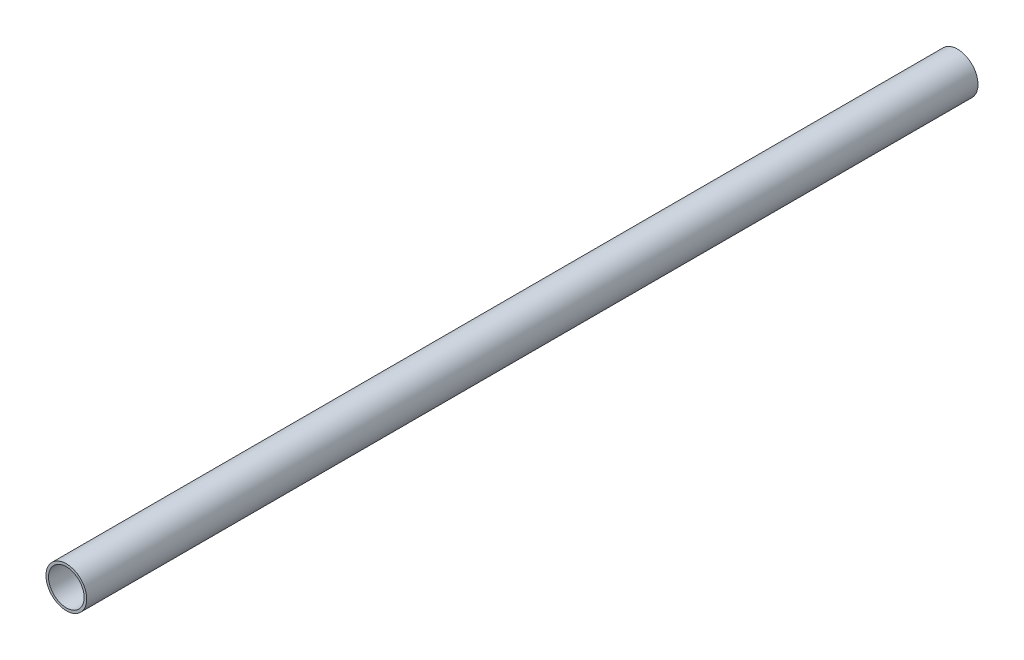
ISO-10303-21;
HEADER;
FILE_DESCRIPTION(('STEP AP214'),'2;1');
FILE_NAME('part.step','',(''),(''),'','','');
FILE_SCHEMA(('AUTOMOTIVE_DESIGN { 1 0 10303 214 1 1 1 1 }'));
ENDSEC;
DATA;
#1=APPLICATION_CONTEXT('core data for automotive mechanical design processes');
#2=APPLICATION_PROTOCOL_DEFINITION('international standard','automotive_design',2000,#1);
#3=PRODUCT_CONTEXT('',#1,'mechanical');
#4=PRODUCT('Part','Part','',(#3));
#5=PRODUCT_RELATED_PRODUCT_CATEGORY('part','',(#4));
#6=PRODUCT_DEFINITION_FORMATION('','',#4);
#7=PRODUCT_DEFINITION_CONTEXT('part definition',#1,'design');
#8=PRODUCT_DEFINITION('design','',#6,#7);
#9=PRODUCT_DEFINITION_SHAPE('','',#8);
#10=(LENGTH_UNIT() NAMED_UNIT(*) SI_UNIT(.MILLI.,.METRE.));
#11=(NAMED_UNIT(*) PLANE_ANGLE_UNIT() SI_UNIT($,.RADIAN.));
#12=(NAMED_UNIT(*) SI_UNIT($,.STERADIAN.) SOLID_ANGLE_UNIT());
#13=UNCERTAINTY_MEASURE_WITH_UNIT(LENGTH_MEASURE(1.E-05),#10,'distance_accuracy_value','');
#14=(GEOMETRIC_REPRESENTATION_CONTEXT(3) GLOBAL_UNCERTAINTY_ASSIGNED_CONTEXT((#13)) GLOBAL_UNIT_ASSIGNED_CONTEXT((#10,
#11,#12)) REPRESENTATION_CONTEXT('',''));
#15=CARTESIAN_POINT('',(0.,0.,0.));
#16=DIRECTION('',(0.,0.,1.));
#17=DIRECTION('',(1.,0.,0.));
#18=AXIS2_PLACEMENT_3D('',#15,#16,#17);
#19=CARTESIAN_POINT('',(0.,0.,700.));
#20=DIRECTION('',(0.,0.,1.));
#21=DIRECTION('',(1.,0.,0.));
#22=AXIS2_PLACEMENT_3D('',#19,#20,#21);
#23=PLANE('',#22);
#24=CARTESIAN_POINT('',(0.,0.,700.));
#25=DIRECTION('',(0.,0.,1.));
#26=DIRECTION('',(1.,0.,0.));
#27=AXIS2_PLACEMENT_3D('',#24,#25,#26);
#28=CIRCLE('',#27,16.);
#29=CARTESIAN_POINT('',(16.,0.,700.));
#30=VERTEX_POINT('',#29);
#31=EDGE_CURVE('E10',#30,#30,#28,.T.);
#32=ORIENTED_EDGE('',*,*,#31,.T.);
#33=EDGE_LOOP('',(#32));
#34=FACE_BOUND('',#33,.T.);
#35=CARTESIAN_POINT('',(0.,0.,700.));
#36=DIRECTION('',(0.,0.,1.));
#37=DIRECTION('',(1.,0.,0.));
#38=AXIS2_PLACEMENT_3D('',#35,#36,#37);
#39=CIRCLE('',#38,14.);
#40=CARTESIAN_POINT('',(14.,0.,700.));
#41=VERTEX_POINT('',#40);
#42=EDGE_CURVE('E42',#41,#41,#39,.T.);
#43=ORIENTED_EDGE('',*,*,#42,.F.);
#44=EDGE_LOOP('',(#43));
#45=FACE_BOUND('',#44,.T.);
#46=ADVANCED_FACE('F31',(#34,#45),#23,.T.);
#47=CARTESIAN_POINT('',(0.,0.,0.));
#48=DIRECTION('',(0.,0.,1.));
#49=DIRECTION('',(1.,0.,0.));
#50=AXIS2_PLACEMENT_3D('',#47,#48,#49);
#51=PLANE('',#50);
#52=CARTESIAN_POINT('',(0.,0.,0.));
#53=DIRECTION('',(0.,0.,1.));
#54=DIRECTION('',(1.,0.,0.));
#55=AXIS2_PLACEMENT_3D('',#52,#53,#54);
#56=CIRCLE('',#55,16.);
#57=CARTESIAN_POINT('',(16.,0.,0.));
#58=VERTEX_POINT('',#57);
#59=EDGE_CURVE('E35',#58,#58,#56,.T.);
#60=ORIENTED_EDGE('',*,*,#59,.F.);
#61=EDGE_LOOP('',(#60));
#62=FACE_BOUND('',#61,.T.);
#63=CARTESIAN_POINT('',(0.,0.,0.));
#64=DIRECTION('',(0.,0.,1.));
#65=DIRECTION('',(1.,0.,0.));
#66=AXIS2_PLACEMENT_3D('',#63,#64,#65);
#67=CIRCLE('',#66,14.);
#68=CARTESIAN_POINT('',(14.,0.,0.));
#69=VERTEX_POINT('',#68);
#70=EDGE_CURVE('E44',#69,#69,#67,.T.);
#71=ORIENTED_EDGE('',*,*,#70,.T.);
#72=EDGE_LOOP('',(#71));
#73=FACE_BOUND('',#72,.T.);
#74=ADVANCED_FACE('F54',(#62,#73),#51,.F.);
#75=CARTESIAN_POINT('',(0.,0.,700.));
#76=DIRECTION('',(0.,0.,-1.));
#77=DIRECTION('',(-1.,0.,0.));
#78=AXIS2_PLACEMENT_3D('',#75,#76,#77);
#79=CYLINDRICAL_SURFACE('',#78,16.);
#80=ORIENTED_EDGE('',*,*,#31,.F.);
#81=EDGE_LOOP('',(#80));
#82=FACE_BOUND('',#81,.T.);
#83=ORIENTED_EDGE('',*,*,#59,.T.);
#84=EDGE_LOOP('',(#83));
#85=FACE_BOUND('',#84,.T.);
#86=ADVANCED_FACE('F33',(#82,#85),#79,.T.);
#87=CARTESIAN_POINT('',(0.,0.,700.));
#88=DIRECTION('',(0.,0.,-1.));
#89=DIRECTION('',(-1.,0.,0.));
#90=AXIS2_PLACEMENT_3D('',#87,#88,#89);
#91=CYLINDRICAL_SURFACE('',#90,14.);
#92=ORIENTED_EDGE('',*,*,#42,.T.);
#93=EDGE_LOOP('',(#92));
#94=FACE_BOUND('',#93,.T.);
#95=ORIENTED_EDGE('',*,*,#70,.F.);
#96=EDGE_LOOP('',(#95));
#97=FACE_BOUND('',#96,.T.);
#98=ADVANCED_FACE('F50',(#94,#97),#91,.F.);
#99=CLOSED_SHELL('',(#46,#74,#86,#98));
#100=MANIFOLD_SOLID_BREP('B2',#99);
#101=ADVANCED_BREP_SHAPE_REPRESENTATION('',(#18,#100),#14);
#102=SHAPE_DEFINITION_REPRESENTATION(#9,#101);
ENDSEC;
END-ISO-10303-21;
